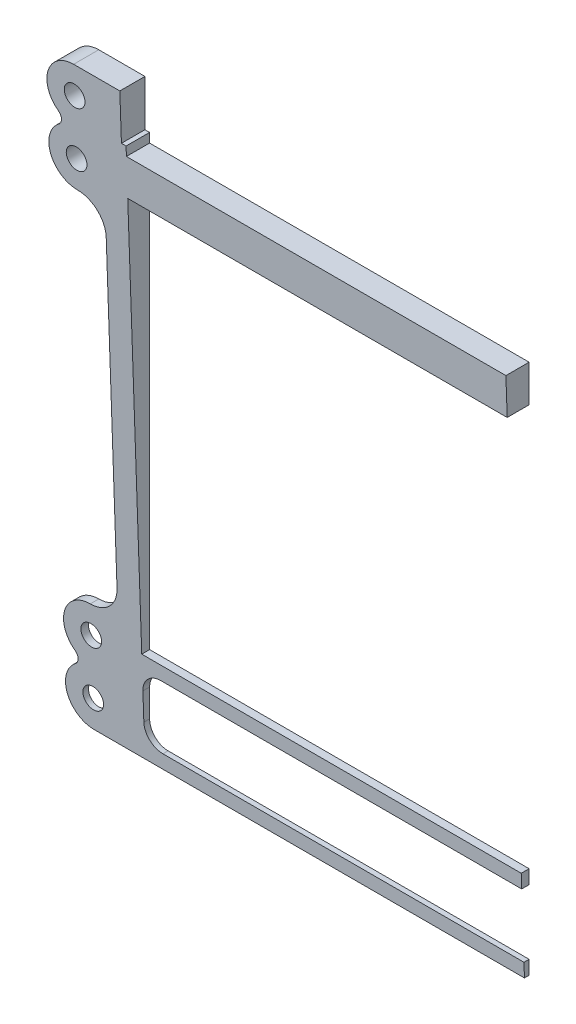
ISO-10303-21;
HEADER;
FILE_DESCRIPTION(('STEP AP214'),'2;1');
FILE_NAME('part.step','',(''),(''),'','','');
FILE_SCHEMA(('AUTOMOTIVE_DESIGN { 1 0 10303 214 1 1 1 1 }'));
ENDSEC;
DATA;
#1=APPLICATION_CONTEXT('core data for automotive mechanical design processes');
#2=APPLICATION_PROTOCOL_DEFINITION('international standard','automotive_design',2000,#1);
#3=PRODUCT_CONTEXT('',#1,'mechanical');
#4=PRODUCT('Part','Part','',(#3));
#5=PRODUCT_RELATED_PRODUCT_CATEGORY('part','',(#4));
#6=PRODUCT_DEFINITION_FORMATION('','',#4);
#7=PRODUCT_DEFINITION_CONTEXT('part definition',#1,'design');
#8=PRODUCT_DEFINITION('design','',#6,#7);
#9=PRODUCT_DEFINITION_SHAPE('','',#8);
#10=(LENGTH_UNIT() NAMED_UNIT(*) SI_UNIT(.MILLI.,.METRE.));
#11=(NAMED_UNIT(*) PLANE_ANGLE_UNIT() SI_UNIT($,.RADIAN.));
#12=(NAMED_UNIT(*) SI_UNIT($,.STERADIAN.) SOLID_ANGLE_UNIT());
#13=UNCERTAINTY_MEASURE_WITH_UNIT(LENGTH_MEASURE(1.E-05),#10,'distance_accuracy_value','');
#14=(GEOMETRIC_REPRESENTATION_CONTEXT(3) GLOBAL_UNCERTAINTY_ASSIGNED_CONTEXT((#13)) GLOBAL_UNIT_ASSIGNED_CONTEXT((#10,
#11,#12)) REPRESENTATION_CONTEXT('',''));
#15=CARTESIAN_POINT('',(0.,0.,0.));
#16=DIRECTION('',(0.,0.,1.));
#17=DIRECTION('',(1.,0.,0.));
#18=AXIS2_PLACEMENT_3D('',#15,#16,#17);
#19=CARTESIAN_POINT('',(0.,9.52500000000004,76.2));
#20=DIRECTION('',(0.,-1.,0.));
#21=DIRECTION('',(1.,0.,0.));
#22=AXIS2_PLACEMENT_3D('',#19,#20,#21);
#23=PLANE('',#22);
#24=DIRECTION('',(1.,0.,0.));
#25=VECTOR('',#24,1.);
#26=CARTESIAN_POINT('',(0.,9.52500000000004,2.70893443136311));
#27=LINE('',#26,#25);
#28=CARTESIAN_POINT('',(-268.897099999997,9.52500000000005,2.7089344313631));
#29=VERTEX_POINT('',#28);
#30=CARTESIAN_POINT('',(-138.423649999999,9.52500000000006,2.7089344313631));
#31=VERTEX_POINT('',#30);
#32=EDGE_CURVE('E233',#29,#31,#27,.T.);
#33=ORIENTED_EDGE('',*,*,#32,.T.);
#34=DIRECTION('',(0.,0.,-1.));
#35=VECTOR('',#34,1.);
#36=CARTESIAN_POINT('',(-138.423649999999,9.52500000000004,76.2));
#37=LINE('',#36,#35);
#38=CARTESIAN_POINT('',(-138.423649999999,9.52500000000005,0.));
#39=VERTEX_POINT('',#38);
#40=EDGE_CURVE('E803',#31,#39,#37,.T.);
#41=ORIENTED_EDGE('',*,*,#40,.T.);
#42=DIRECTION('',(-1.,0.,0.));
#43=VECTOR('',#42,1.);
#44=CARTESIAN_POINT('',(0.,9.52500000000004,0.));
#45=LINE('',#44,#43);
#46=CARTESIAN_POINT('',(-268.897099999997,9.52500000000005,0.));
#47=VERTEX_POINT('',#46);
#48=EDGE_CURVE('E300',#39,#47,#45,.T.);
#49=ORIENTED_EDGE('',*,*,#48,.T.);
#50=DIRECTION('',(0.,0.,-1.));
#51=VECTOR('',#50,1.);
#52=CARTESIAN_POINT('',(-268.897099999997,9.52500000000005,76.2));
#53=LINE('',#52,#51);
#54=EDGE_CURVE('E321',#29,#47,#53,.T.);
#55=ORIENTED_EDGE('',*,*,#54,.F.);
#56=EDGE_LOOP('',(#33,#41,#49,#55));
#57=FACE_BOUND('',#56,.T.);
#58=ADVANCED_FACE('F34',(#57),#23,.F.);
#59=CARTESIAN_POINT('',(-268.897099999997,0.,76.2));
#60=DIRECTION('',(-1.,0.,0.));
#61=DIRECTION('',(0.,0.,1.));
#62=AXIS2_PLACEMENT_3D('',#59,#60,#61);
#63=PLANE('',#62);
#64=DIRECTION('',(0.,0.,-1.));
#65=VECTOR('',#64,1.);
#66=CARTESIAN_POINT('',(-268.897099999997,147.6502,76.2));
#67=LINE('',#66,#65);
#68=CARTESIAN_POINT('',(-268.897099999997,147.6502,7.53237270156516));
#69=VERTEX_POINT('',#68);
#70=CARTESIAN_POINT('',(-268.897099999997,147.6502,0.));
#71=VERTEX_POINT('',#70);
#72=EDGE_CURVE('E319',#69,#71,#67,.T.);
#73=ORIENTED_EDGE('',*,*,#72,.F.);
#74=DIRECTION('',(0.,-0.999390827019096,-0.0348994967025044));
#75=VECTOR('',#74,1.);
#76=CARTESIAN_POINT('',(-268.897099999997,2.57484000352105,2.46622949619527));
#77=LINE('',#76,#75);
#78=EDGE_CURVE('E229',#69,#29,#77,.T.);
#79=ORIENTED_EDGE('',*,*,#78,.T.);
#80=ORIENTED_EDGE('',*,*,#54,.T.);
#81=DIRECTION('',(0.,1.,0.));
#82=VECTOR('',#81,1.);
#83=CARTESIAN_POINT('',(-268.897099999997,0.,0.));
#84=LINE('',#83,#82);
#85=EDGE_CURVE('E302',#47,#71,#84,.T.);
#86=ORIENTED_EDGE('',*,*,#85,.T.);
#87=EDGE_LOOP('',(#73,#79,#80,#86));
#88=FACE_BOUND('',#87,.T.);
#89=ADVANCED_FACE('F477',(#88),#63,.F.);
#90=CARTESIAN_POINT('',(0.,-22.225,76.2));
#91=DIRECTION('',(0.,1.,0.));
#92=DIRECTION('',(0.,0.,1.));
#93=AXIS2_PLACEMENT_3D('',#90,#91,#92);
#94=PLANE('',#93);
#95=DIRECTION('',(1.,0.,0.));
#96=VECTOR('',#95,1.);
#97=CARTESIAN_POINT('',(0.,-22.225,0.));
#98=LINE('',#97,#96);
#99=CARTESIAN_POINT('',(-286.359599999998,-22.225,0.));
#100=VERTEX_POINT('',#99);
#101=CARTESIAN_POINT('',(-138.423649999999,-22.225,0.));
#102=VERTEX_POINT('',#101);
#103=EDGE_CURVE('E264',#100,#102,#98,.T.);
#104=ORIENTED_EDGE('',*,*,#103,.T.);
#105=DIRECTION('',(0.,0.,1.));
#106=VECTOR('',#105,1.);
#107=CARTESIAN_POINT('',(-138.423649999999,-22.225,76.2));
#108=LINE('',#107,#106);
#109=CARTESIAN_POINT('',(-138.423649999999,-22.225,1.6002));
#110=VERTEX_POINT('',#109);
#111=EDGE_CURVE('E811',#102,#110,#108,.T.);
#112=ORIENTED_EDGE('',*,*,#111,.T.);
#113=DIRECTION('',(-1.,0.,0.));
#114=VECTOR('',#113,1.);
#115=CARTESIAN_POINT('',(19.0500000000025,-22.225,1.6002));
#116=LINE('',#115,#114);
#117=CARTESIAN_POINT('',(-286.359599999998,-22.225,1.6002));
#118=VERTEX_POINT('',#117);
#119=EDGE_CURVE('E418',#110,#118,#116,.T.);
#120=ORIENTED_EDGE('',*,*,#119,.T.);
#121=DIRECTION('',(0.,0.,-1.));
#122=VECTOR('',#121,1.);
#123=CARTESIAN_POINT('',(-286.359599999998,-22.225,76.2));
#124=LINE('',#123,#122);
#125=EDGE_CURVE('E318',#118,#100,#124,.T.);
#126=ORIENTED_EDGE('',*,*,#125,.T.);
#127=EDGE_LOOP('',(#104,#112,#120,#126));
#128=FACE_BOUND('',#127,.T.);
#129=ADVANCED_FACE('F470',(#128),#94,.F.);
#130=CARTESIAN_POINT('',(0.,160.3502,76.2));
#131=DIRECTION('',(0.,-1.,0.));
#132=DIRECTION('',(0.,0.,-1.));
#133=AXIS2_PLACEMENT_3D('',#130,#131,#132);
#134=PLANE('',#133);
#135=DIRECTION('',(1.,0.,0.));
#136=VECTOR('',#135,1.);
#137=CARTESIAN_POINT('',(0.,160.3502,7.97586647411037));
#138=LINE('',#137,#136);
#139=CARTESIAN_POINT('',(-268.909799999999,160.3502,7.97586647411037));
#140=VERTEX_POINT('',#139);
#141=CARTESIAN_POINT('',(-138.423649999999,160.3502,7.97586647411037));
#142=VERTEX_POINT('',#141);
#143=EDGE_CURVE('E262',#140,#142,#138,.T.);
#144=ORIENTED_EDGE('',*,*,#143,.T.);
#145=DIRECTION('',(0.,0.,-1.));
#146=VECTOR('',#145,1.);
#147=CARTESIAN_POINT('',(-138.423649999999,160.3502,76.2));
#148=LINE('',#147,#146);
#149=CARTESIAN_POINT('',(-138.423649999999,160.3502,0.));
#150=VERTEX_POINT('',#149);
#151=EDGE_CURVE('E49',#142,#150,#148,.T.);
#152=ORIENTED_EDGE('',*,*,#151,.T.);
#153=DIRECTION('',(-1.,0.,0.));
#154=VECTOR('',#153,1.);
#155=CARTESIAN_POINT('',(0.,160.3502,0.));
#156=LINE('',#155,#154);
#157=CARTESIAN_POINT('',(-268.909799999999,160.3502,0.));
#158=VERTEX_POINT('',#157);
#159=EDGE_CURVE('E267',#150,#158,#156,.T.);
#160=ORIENTED_EDGE('',*,*,#159,.T.);
#161=DIRECTION('',(0.,0.,-1.));
#162=VECTOR('',#161,1.);
#163=CARTESIAN_POINT('',(-268.909799999999,160.3502,76.2));
#164=LINE('',#163,#162);
#165=EDGE_CURVE('E322',#140,#158,#164,.T.);
#166=ORIENTED_EDGE('',*,*,#165,.F.);
#167=EDGE_LOOP('',(#144,#152,#160,#166));
#168=FACE_BOUND('',#167,.T.);
#169=ADVANCED_FACE('F468',(#168),#134,.F.);
#170=CARTESIAN_POINT('',(-268.909799999999,0.,76.2));
#171=DIRECTION('',(-1.,0.,0.));
#172=DIRECTION('',(0.,0.,1.));
#173=AXIS2_PLACEMENT_3D('',#170,#171,#172);
#174=PLANE('',#173);
#175=DIRECTION('',(0.,0.,-1.));
#176=VECTOR('',#175,1.);
#177=CARTESIAN_POINT('',(-268.909799999999,163.5252,76.2));
#178=LINE('',#177,#176);
#179=CARTESIAN_POINT('',(-268.909799999999,163.5252,8.08673991724669));
#180=VERTEX_POINT('',#179);
#181=CARTESIAN_POINT('',(-268.909799999999,163.5252,0.));
#182=VERTEX_POINT('',#181);
#183=EDGE_CURVE('E343',#180,#182,#178,.T.);
#184=ORIENTED_EDGE('',*,*,#183,.F.);
#185=DIRECTION('',(0.,-0.999390827019096,-0.0348994967025044));
#186=VECTOR('',#185,1.);
#187=CARTESIAN_POINT('',(-268.909799999999,2.57484000352105,2.46622949619527));
#188=LINE('',#187,#186);
#189=EDGE_CURVE('E259',#180,#140,#188,.T.);
#190=ORIENTED_EDGE('',*,*,#189,.T.);
#191=ORIENTED_EDGE('',*,*,#165,.T.);
#192=DIRECTION('',(0.,1.,0.));
#193=VECTOR('',#192,1.);
#194=CARTESIAN_POINT('',(-268.909799999999,0.,0.));
#195=LINE('',#194,#193);
#196=EDGE_CURVE('E269',#158,#182,#195,.T.);
#197=ORIENTED_EDGE('',*,*,#196,.T.);
#198=EDGE_LOOP('',(#184,#190,#191,#197));
#199=FACE_BOUND('',#198,.T.);
#200=ADVANCED_FACE('F465',(#199),#174,.F.);
#201=CARTESIAN_POINT('',(0.,163.5252,76.2));
#202=DIRECTION('',(0.,-1.,0.));
#203=DIRECTION('',(0.,0.,-1.));
#204=AXIS2_PLACEMENT_3D('',#201,#202,#203);
#205=PLANE('',#204);
#206=DIRECTION('',(0.,0.,-1.));
#207=VECTOR('',#206,1.);
#208=CARTESIAN_POINT('',(-270.509999999999,163.5252,76.2));
#209=LINE('',#208,#207);
#210=CARTESIAN_POINT('',(-270.509999999999,163.5252,8.08673991724668));
#211=VERTEX_POINT('',#210);
#212=CARTESIAN_POINT('',(-270.509999999999,163.5252,0.));
#213=VERTEX_POINT('',#212);
#214=EDGE_CURVE('E341',#211,#213,#209,.T.);
#215=ORIENTED_EDGE('',*,*,#214,.F.);
#216=DIRECTION('',(1.,0.,0.));
#217=VECTOR('',#216,1.);
#218=CARTESIAN_POINT('',(0.,163.5252,8.08673991724669));
#219=LINE('',#218,#217);
#220=EDGE_CURVE('E256',#211,#180,#219,.T.);
#221=ORIENTED_EDGE('',*,*,#220,.T.);
#222=ORIENTED_EDGE('',*,*,#183,.T.);
#223=DIRECTION('',(-1.,0.,0.));
#224=VECTOR('',#223,1.);
#225=CARTESIAN_POINT('',(0.,163.5252,0.));
#226=LINE('',#225,#224);
#227=EDGE_CURVE('E272',#182,#213,#226,.T.);
#228=ORIENTED_EDGE('',*,*,#227,.T.);
#229=EDGE_LOOP('',(#215,#221,#222,#228));
#230=FACE_BOUND('',#229,.T.);
#231=ADVANCED_FACE('F462',(#230),#205,.F.);
#232=CARTESIAN_POINT('',(-270.509999999999,0.,76.2));
#233=DIRECTION('',(-1.,0.,0.));
#234=DIRECTION('',(0.,0.,1.));
#235=AXIS2_PLACEMENT_3D('',#232,#233,#234);
#236=PLANE('',#235);
#237=DIRECTION('',(0.,0.,-1.));
#238=VECTOR('',#237,1.);
#239=CARTESIAN_POINT('',(-270.509999999999,179.4002,76.2));
#240=LINE('',#239,#238);
#241=CARTESIAN_POINT('',(-270.509999999999,179.4002,8.64110713292823));
#242=VERTEX_POINT('',#241);
#243=CARTESIAN_POINT('',(-270.509999999999,179.4002,0.));
#244=VERTEX_POINT('',#243);
#245=EDGE_CURVE('E339',#242,#244,#240,.T.);
#246=ORIENTED_EDGE('',*,*,#245,.F.);
#247=DIRECTION('',(0.,-0.999390827019096,-0.0348994967025044));
#248=VECTOR('',#247,1.);
#249=CARTESIAN_POINT('',(-270.509999999999,2.57484000352105,2.46622949619527));
#250=LINE('',#249,#248);
#251=EDGE_CURVE('E253',#242,#211,#250,.T.);
#252=ORIENTED_EDGE('',*,*,#251,.T.);
#253=ORIENTED_EDGE('',*,*,#214,.T.);
#254=DIRECTION('',(0.,1.,0.));
#255=VECTOR('',#254,1.);
#256=CARTESIAN_POINT('',(-270.509999999999,0.,0.));
#257=LINE('',#256,#255);
#258=EDGE_CURVE('E275',#213,#244,#257,.T.);
#259=ORIENTED_EDGE('',*,*,#258,.T.);
#260=EDGE_LOOP('',(#246,#252,#253,#259));
#261=FACE_BOUND('',#260,.T.);
#262=ADVANCED_FACE('F459',(#261),#236,.F.);
#263=CARTESIAN_POINT('',(0.,179.4002,76.2));
#264=DIRECTION('',(0.,-1.,0.));
#265=DIRECTION('',(0.,0.,-1.));
#266=AXIS2_PLACEMENT_3D('',#263,#264,#265);
#267=PLANE('',#266);
#268=DIRECTION('',(0.,0.,-1.));
#269=VECTOR('',#268,1.);
#270=CARTESIAN_POINT('',(-286.384999999999,179.4002,76.2));
#271=LINE('',#270,#269);
#272=CARTESIAN_POINT('',(-286.384999999999,179.4002,8.64110713292823));
#273=VERTEX_POINT('',#272);
#274=CARTESIAN_POINT('',(-286.384999999999,179.4002,0.));
#275=VERTEX_POINT('',#274);
#276=EDGE_CURVE('E337',#273,#275,#271,.T.);
#277=ORIENTED_EDGE('',*,*,#276,.F.);
#278=DIRECTION('',(-1.,0.,0.));
#279=VECTOR('',#278,1.);
#280=CARTESIAN_POINT('',(19.0500000000025,179.4002,8.64110713292823));
#281=LINE('',#280,#279);
#282=EDGE_CURVE('E417',#242,#273,#281,.T.);
#283=ORIENTED_EDGE('',*,*,#282,.F.);
#284=ORIENTED_EDGE('',*,*,#245,.T.);
#285=DIRECTION('',(-1.,0.,0.));
#286=VECTOR('',#285,1.);
#287=CARTESIAN_POINT('',(0.,179.4002,0.));
#288=LINE('',#287,#286);
#289=EDGE_CURVE('E278',#244,#275,#288,.T.);
#290=ORIENTED_EDGE('',*,*,#289,.T.);
#291=EDGE_LOOP('',(#277,#283,#284,#290));
#292=FACE_BOUND('',#291,.T.);
#293=ADVANCED_FACE('F453',(#292),#267,.F.);
#294=CARTESIAN_POINT('',(-286.384999999999,169.8752,76.2));
#295=DIRECTION('',(0.,0.,-1.));
#296=DIRECTION('',(-1.,0.,0.));
#297=AXIS2_PLACEMENT_3D('',#294,#295,#296);
#298=CYLINDRICAL_SURFACE('',#297,9.52500000000001);
#299=CARTESIAN_POINT('',(-286.384999999999,169.8752,0.));
#300=DIRECTION('',(0.,0.,1.));
#301=DIRECTION('',(1.,0.,0.));
#302=AXIS2_PLACEMENT_3D('',#299,#300,#301);
#303=CIRCLE('',#302,9.52500000000001);
#304=CARTESIAN_POINT('',(-292.226279898648,162.35156562919,0.));
#305=VERTEX_POINT('',#304);
#306=EDGE_CURVE('E281',#275,#305,#303,.T.);
#307=ORIENTED_EDGE('',*,*,#306,.T.);
#308=DIRECTION('',(0.,0.,-1.));
#309=VECTOR('',#308,1.);
#310=CARTESIAN_POINT('',(-292.226279898648,162.35156562919,76.2));
#311=LINE('',#310,#309);
#312=CARTESIAN_POINT('',(-292.226279898648,162.35156562919,8.04575570191603));
#313=VERTEX_POINT('',#312);
#314=EDGE_CURVE('E349',#305,#313,#311,.F.);
#315=ORIENTED_EDGE('',*,*,#314,.T.);
#316=CARTESIAN_POINT('',(-286.384999999999,169.8752,8.30848680351931));
#317=DIRECTION('',(0.,0.0348994967025044,-0.999390827019096));
#318=DIRECTION('',(0.,-0.999390827019096,-0.0348994967025044));
#319=AXIS2_PLACEMENT_3D('',#316,#317,#318);
#320=ELLIPSE('',#319,9.53080590944628,9.52500000000001);
#321=EDGE_CURVE('E231',#313,#273,#320,.T.);
#322=ORIENTED_EDGE('',*,*,#321,.T.);
#323=ORIENTED_EDGE('',*,*,#276,.T.);
#324=EDGE_LOOP('',(#307,#315,#322,#323));
#325=FACE_BOUND('',#324,.T.);
#326=ADVANCED_FACE('F448',(#325),#298,.T.);
#327=CARTESIAN_POINT('',(-286.372299999997,150.8252,76.2));
#328=DIRECTION('',(0.,0.,-1.));
#329=DIRECTION('',(-1.,0.,0.));
#330=AXIS2_PLACEMENT_3D('',#327,#328,#329);
#331=CYLINDRICAL_SURFACE('',#330,9.52500000000001);
#332=CARTESIAN_POINT('',(-286.372299999997,150.8252,7.64324614470145));
#333=DIRECTION('',(0.,0.0348994967025044,-0.999390827019096));
#334=DIRECTION('',(0.,-0.999390827019096,-0.0348994967025044));
#335=AXIS2_PLACEMENT_3D('',#332,#333,#334);
#336=ELLIPSE('',#335,9.53080590944628,9.52500000000001);
#337=CARTESIAN_POINT('',(-286.372299999997,141.3002,7.31062581529253));
#338=VERTEX_POINT('',#337);
#339=CARTESIAN_POINT('',(-292.223606214438,158.3410393134,7.90570503690175));
#340=VERTEX_POINT('',#339);
#341=EDGE_CURVE('E235',#338,#340,#336,.T.);
#342=ORIENTED_EDGE('',*,*,#341,.T.);
#343=DIRECTION('',(0.,0.,-1.));
#344=VECTOR('',#343,1.);
#345=CARTESIAN_POINT('',(-292.223606214438,158.3410393134,76.2));
#346=LINE('',#345,#344);
#347=CARTESIAN_POINT('',(-292.223606214438,158.3410393134,0.));
#348=VERTEX_POINT('',#347);
#349=EDGE_CURVE('E325',#340,#348,#346,.T.);
#350=ORIENTED_EDGE('',*,*,#349,.T.);
#351=CARTESIAN_POINT('',(-286.372299999997,150.8252,0.));
#352=DIRECTION('',(0.,0.,1.));
#353=DIRECTION('',(1.,0.,0.));
#354=AXIS2_PLACEMENT_3D('',#351,#352,#353);
#355=CIRCLE('',#354,9.52500000000001);
#356=CARTESIAN_POINT('',(-286.372299999997,141.3002,0.));
#357=VERTEX_POINT('',#356);
#358=EDGE_CURVE('E284',#348,#357,#355,.T.);
#359=ORIENTED_EDGE('',*,*,#358,.T.);
#360=DIRECTION('',(0.,0.,-1.));
#361=VECTOR('',#360,1.);
#362=CARTESIAN_POINT('',(-286.372299999997,141.3002,76.2));
#363=LINE('',#362,#361);
#364=EDGE_CURVE('E334',#338,#357,#363,.T.);
#365=ORIENTED_EDGE('',*,*,#364,.F.);
#366=EDGE_LOOP('',(#342,#350,#359,#365));
#367=FACE_BOUND('',#366,.T.);
#368=ADVANCED_FACE('F438',(#367),#331,.T.);
#369=CARTESIAN_POINT('',(-286.372299999997,131.7752,76.2));
#370=DIRECTION('',(0.,0.,-1.));
#371=DIRECTION('',(-1.,0.,0.));
#372=AXIS2_PLACEMENT_3D('',#369,#370,#371);
#373=CYLINDRICAL_SURFACE('',#372,9.52500000000001);
#374=CARTESIAN_POINT('',(-286.372299999997,131.7752,6.97800548588359));
#375=DIRECTION('',(0.,0.0348994967025044,-0.999390827019096));
#376=DIRECTION('',(0.,-0.999390827019096,-0.0348994967025044));
#377=AXIS2_PLACEMENT_3D('',#374,#375,#376);
#378=ELLIPSE('',#377,9.53080590944628,9.52500000000001);
#379=CARTESIAN_POINT('',(-276.847299999997,131.7752,6.97800548588358));
#380=VERTEX_POINT('',#379);
#381=EDGE_CURVE('E433',#338,#380,#378,.T.);
#382=ORIENTED_EDGE('',*,*,#381,.F.);
#383=ORIENTED_EDGE('',*,*,#364,.T.);
#384=CARTESIAN_POINT('',(-286.372299999997,131.7752,0.));
#385=DIRECTION('',(0.,0.,1.));
#386=DIRECTION('',(1.,0.,0.));
#387=AXIS2_PLACEMENT_3D('',#384,#385,#386);
#388=CIRCLE('',#387,9.52500000000001);
#389=CARTESIAN_POINT('',(-276.847299999997,131.7752,0.));
#390=VERTEX_POINT('',#389);
#391=EDGE_CURVE('E286',#390,#357,#388,.T.);
#392=ORIENTED_EDGE('',*,*,#391,.F.);
#393=DIRECTION('',(0.,0.,-1.));
#394=VECTOR('',#393,1.);
#395=CARTESIAN_POINT('',(-276.847299999997,131.7752,76.2));
#396=LINE('',#395,#394);
#397=EDGE_CURVE('E332',#380,#390,#396,.T.);
#398=ORIENTED_EDGE('',*,*,#397,.F.);
#399=EDGE_LOOP('',(#382,#383,#392,#398));
#400=FACE_BOUND('',#399,.T.);
#401=ADVANCED_FACE('F506',(#400),#373,.F.);
#402=CARTESIAN_POINT('',(-276.847299999997,0.,76.2));
#403=DIRECTION('',(1.,0.,0.));
#404=DIRECTION('',(0.,0.,-1.));
#405=AXIS2_PLACEMENT_3D('',#402,#403,#404);
#406=PLANE('',#405);
#407=DIRECTION('',(0.,0.,-1.));
#408=VECTOR('',#407,1.);
#409=CARTESIAN_POINT('',(-276.847299999997,25.4,76.2));
#410=LINE('',#409,#408);
#411=CARTESIAN_POINT('',(-276.847299999997,25.4,3.26330164704465));
#412=VERTEX_POINT('',#411);
#413=CARTESIAN_POINT('',(-276.847299999997,25.4,0.));
#414=VERTEX_POINT('',#413);
#415=EDGE_CURVE('E330',#412,#414,#410,.T.);
#416=ORIENTED_EDGE('',*,*,#415,.F.);
#417=DIRECTION('',(0.,0.999390827019096,0.0348994967025044));
#418=VECTOR('',#417,1.);
#419=CARTESIAN_POINT('',(-276.847299999997,2.57484000352105,2.46622949619527));
#420=LINE('',#419,#418);
#421=EDGE_CURVE('E430',#412,#380,#420,.T.);
#422=ORIENTED_EDGE('',*,*,#421,.T.);
#423=ORIENTED_EDGE('',*,*,#397,.T.);
#424=DIRECTION('',(0.,-1.,0.));
#425=VECTOR('',#424,1.);
#426=CARTESIAN_POINT('',(-276.847299999997,0.,0.));
#427=LINE('',#426,#425);
#428=EDGE_CURVE('E289',#390,#414,#427,.T.);
#429=ORIENTED_EDGE('',*,*,#428,.T.);
#430=EDGE_LOOP('',(#416,#422,#423,#429));
#431=FACE_BOUND('',#430,.T.);
#432=ADVANCED_FACE('F502',(#431),#406,.F.);
#433=CARTESIAN_POINT('',(-286.372299999997,25.4,76.2));
#434=DIRECTION('',(0.,0.,-1.));
#435=DIRECTION('',(-1.,0.,0.));
#436=AXIS2_PLACEMENT_3D('',#433,#434,#435);
#437=CYLINDRICAL_SURFACE('',#436,9.525);
#438=CARTESIAN_POINT('',(-286.372299999997,25.4,3.26330164704465));
#439=DIRECTION('',(0.,0.0348994967025044,-0.999390827019096));
#440=DIRECTION('',(0.,-0.999390827019096,-0.0348994967025044));
#441=AXIS2_PLACEMENT_3D('',#438,#439,#440);
#442=ELLIPSE('',#441,9.53080590944628,9.525);
#443=CARTESIAN_POINT('',(-286.372299999997,15.875,2.93068131763571));
#444=VERTEX_POINT('',#443);
#445=EDGE_CURVE('E427',#412,#444,#442,.T.);
#446=ORIENTED_EDGE('',*,*,#445,.F.);
#447=ORIENTED_EDGE('',*,*,#415,.T.);
#448=CARTESIAN_POINT('',(-286.372299999997,25.4,0.));
#449=DIRECTION('',(0.,0.,1.));
#450=DIRECTION('',(1.,0.,0.));
#451=AXIS2_PLACEMENT_3D('',#448,#449,#450);
#452=CIRCLE('',#451,9.525);
#453=CARTESIAN_POINT('',(-286.372299999997,15.875,0.));
#454=VERTEX_POINT('',#453);
#455=EDGE_CURVE('E292',#454,#414,#452,.T.);
#456=ORIENTED_EDGE('',*,*,#455,.F.);
#457=DIRECTION('',(0.,0.,-1.));
#458=VECTOR('',#457,1.);
#459=CARTESIAN_POINT('',(-286.372299999997,15.875,76.2));
#460=LINE('',#459,#458);
#461=EDGE_CURVE('E328',#444,#454,#460,.T.);
#462=ORIENTED_EDGE('',*,*,#461,.F.);
#463=EDGE_LOOP('',(#446,#447,#456,#462));
#464=FACE_BOUND('',#463,.T.);
#465=ADVANCED_FACE('F498',(#464),#437,.F.);
#466=CARTESIAN_POINT('',(-286.372299999997,6.35000000000004,76.2));
#467=DIRECTION('',(0.,0.,-1.));
#468=DIRECTION('',(-1.,0.,0.));
#469=AXIS2_PLACEMENT_3D('',#466,#467,#468);
#470=CYLINDRICAL_SURFACE('',#469,9.525);
#471=CARTESIAN_POINT('',(-286.372299999997,6.35000000000004,0.));
#472=DIRECTION('',(0.,0.,1.));
#473=DIRECTION('',(1.,0.,0.));
#474=AXIS2_PLACEMENT_3D('',#471,#472,#473);
#475=CIRCLE('',#474,9.525);
#476=CARTESIAN_POINT('',(-292.213579898648,-1.17363437080932,0.));
#477=VERTEX_POINT('',#476);
#478=EDGE_CURVE('E295',#454,#477,#475,.T.);
#479=ORIENTED_EDGE('',*,*,#478,.T.);
#480=DIRECTION('',(0.,0.,-1.));
#481=VECTOR('',#480,1.);
#482=CARTESIAN_POINT('',(-292.213579898648,-1.17363437080932,76.2));
#483=LINE('',#482,#481);
#484=CARTESIAN_POINT('',(-292.213579898648,-1.17363437080932,2.33532988662354));
#485=VERTEX_POINT('',#484);
#486=EDGE_CURVE('E354',#477,#485,#483,.F.);
#487=ORIENTED_EDGE('',*,*,#486,.T.);
#488=CARTESIAN_POINT('',(-286.372299999997,6.35000000000004,2.59806098822679));
#489=DIRECTION('',(0.,0.0348994967025044,-0.999390827019096));
#490=DIRECTION('',(0.,-0.999390827019096,-0.0348994967025044));
#491=AXIS2_PLACEMENT_3D('',#488,#489,#490);
#492=ELLIPSE('',#491,9.53080590944628,9.525);
#493=EDGE_CURVE('E425',#485,#444,#492,.T.);
#494=ORIENTED_EDGE('',*,*,#493,.T.);
#495=ORIENTED_EDGE('',*,*,#461,.T.);
#496=EDGE_LOOP('',(#479,#487,#494,#495));
#497=FACE_BOUND('',#496,.T.);
#498=ADVANCED_FACE('F494',(#497),#470,.T.);
#499=CARTESIAN_POINT('',(-286.359599999998,-12.7,76.2));
#500=DIRECTION('',(0.,0.,-1.));
#501=DIRECTION('',(-1.,0.,0.));
#502=AXIS2_PLACEMENT_3D('',#499,#500,#501);
#503=CYLINDRICAL_SURFACE('',#502,3.55600000000001);
#504=CARTESIAN_POINT('',(-286.359599999998,-12.7,1.93282032940893));
#505=DIRECTION('',(0.,0.0348994967025044,-0.999390827019096));
#506=DIRECTION('',(0.,-0.999390827019096,-0.0348994967025044));
#507=AXIS2_PLACEMENT_3D('',#504,#505,#506);
#508=ELLIPSE('',#507,3.55816753952662,3.55600000000001);
#509=CARTESIAN_POINT('',(-286.359599999998,-16.256,1.80864207309626));
#510=VERTEX_POINT('',#509);
#511=EDGE_CURVE('E250',#510,#510,#508,.T.);
#512=ORIENTED_EDGE('',*,*,#511,.F.);
#513=EDGE_LOOP('',(#512));
#514=FACE_BOUND('',#513,.T.);
#515=CARTESIAN_POINT('',(-286.359599999998,-12.7,0.));
#516=DIRECTION('',(0.,0.,1.));
#517=DIRECTION('',(1.,0.,0.));
#518=AXIS2_PLACEMENT_3D('',#515,#516,#517);
#519=CIRCLE('',#518,3.55600000000001);
#520=CARTESIAN_POINT('',(-282.803599999998,-12.7,0.));
#521=VERTEX_POINT('',#520);
#522=EDGE_CURVE('E315',#521,#521,#519,.T.);
#523=ORIENTED_EDGE('',*,*,#522,.F.);
#524=EDGE_LOOP('',(#523));
#525=FACE_BOUND('',#524,.T.);
#526=ADVANCED_FACE('F497',(#514,#525),#503,.F.);
#527=CARTESIAN_POINT('',(-286.384999999999,169.8752,76.2));
#528=DIRECTION('',(0.,0.,-1.));
#529=DIRECTION('',(-1.,0.,0.));
#530=AXIS2_PLACEMENT_3D('',#527,#528,#529);
#531=CYLINDRICAL_SURFACE('',#530,3.55600000000001);
#532=CARTESIAN_POINT('',(-286.384999999999,169.8752,8.30848680351931));
#533=DIRECTION('',(0.,0.0348994967025044,-0.999390827019096));
#534=DIRECTION('',(0.,-0.999390827019096,-0.0348994967025044));
#535=AXIS2_PLACEMENT_3D('',#532,#533,#534);
#536=ELLIPSE('',#535,3.55816753952662,3.55600000000001);
#537=CARTESIAN_POINT('',(-286.384999999999,166.3192,8.18430854720664));
#538=VERTEX_POINT('',#537);
#539=EDGE_CURVE('E247',#538,#538,#536,.T.);
#540=ORIENTED_EDGE('',*,*,#539,.F.);
#541=EDGE_LOOP('',(#540));
#542=FACE_BOUND('',#541,.T.);
#543=CARTESIAN_POINT('',(-286.384999999999,169.8752,0.));
#544=DIRECTION('',(0.,0.,1.));
#545=DIRECTION('',(1.,0.,0.));
#546=AXIS2_PLACEMENT_3D('',#543,#544,#545);
#547=CIRCLE('',#546,3.55600000000001);
#548=CARTESIAN_POINT('',(-282.828999999999,169.8752,0.));
#549=VERTEX_POINT('',#548);
#550=EDGE_CURVE('E312',#549,#549,#547,.T.);
#551=ORIENTED_EDGE('',*,*,#550,.F.);
#552=EDGE_LOOP('',(#551));
#553=FACE_BOUND('',#552,.T.);
#554=ADVANCED_FACE('F564',(#542,#553),#531,.F.);
#555=CARTESIAN_POINT('',(-286.372299999997,6.35000000000004,76.2));
#556=DIRECTION('',(0.,0.,-1.));
#557=DIRECTION('',(-1.,0.,0.));
#558=AXIS2_PLACEMENT_3D('',#555,#556,#557);
#559=CYLINDRICAL_SURFACE('',#558,3.55600000000001);
#560=CARTESIAN_POINT('',(-286.372299999997,6.35000000000004,2.59806098822679));
#561=DIRECTION('',(0.,0.0348994967025044,-0.999390827019096));
#562=DIRECTION('',(0.,-0.999390827019096,-0.0348994967025044));
#563=AXIS2_PLACEMENT_3D('',#560,#561,#562);
#564=ELLIPSE('',#563,3.55816753952662,3.55600000000001);
#565=CARTESIAN_POINT('',(-286.372299999997,2.79400000000003,2.47388273191412));
#566=VERTEX_POINT('',#565);
#567=EDGE_CURVE('E244',#566,#566,#564,.T.);
#568=ORIENTED_EDGE('',*,*,#567,.F.);
#569=EDGE_LOOP('',(#568));
#570=FACE_BOUND('',#569,.T.);
#571=CARTESIAN_POINT('',(-286.372299999997,6.35000000000004,0.));
#572=DIRECTION('',(0.,0.,1.));
#573=DIRECTION('',(1.,0.,0.));
#574=AXIS2_PLACEMENT_3D('',#571,#572,#573);
#575=CIRCLE('',#574,3.55600000000001);
#576=CARTESIAN_POINT('',(-282.816299999997,6.35000000000004,0.));
#577=VERTEX_POINT('',#576);
#578=EDGE_CURVE('E309',#577,#577,#575,.T.);
#579=ORIENTED_EDGE('',*,*,#578,.F.);
#580=EDGE_LOOP('',(#579));
#581=FACE_BOUND('',#580,.T.);
#582=ADVANCED_FACE('F572',(#570,#581),#559,.F.);
#583=CARTESIAN_POINT('',(-286.372299999997,150.8252,76.2));
#584=DIRECTION('',(0.,0.,-1.));
#585=DIRECTION('',(-1.,0.,0.));
#586=AXIS2_PLACEMENT_3D('',#583,#584,#585);
#587=CYLINDRICAL_SURFACE('',#586,3.55600000000001);
#588=CARTESIAN_POINT('',(-286.372299999997,150.8252,7.64324614470145));
#589=DIRECTION('',(0.,0.0348994967025044,-0.999390827019096));
#590=DIRECTION('',(0.,-0.999390827019096,-0.0348994967025044));
#591=AXIS2_PLACEMENT_3D('',#588,#589,#590);
#592=ELLIPSE('',#591,3.55816753952662,3.55600000000001);
#593=CARTESIAN_POINT('',(-286.372299999997,147.2692,7.51906788838878));
#594=VERTEX_POINT('',#593);
#595=EDGE_CURVE('E241',#594,#594,#592,.T.);
#596=ORIENTED_EDGE('',*,*,#595,.F.);
#597=EDGE_LOOP('',(#596));
#598=FACE_BOUND('',#597,.T.);
#599=CARTESIAN_POINT('',(-286.372299999997,150.8252,0.));
#600=DIRECTION('',(0.,0.,1.));
#601=DIRECTION('',(1.,0.,0.));
#602=AXIS2_PLACEMENT_3D('',#599,#600,#601);
#603=CIRCLE('',#602,3.55600000000001);
#604=CARTESIAN_POINT('',(-282.816299999997,150.8252,0.));
#605=VERTEX_POINT('',#604);
#606=EDGE_CURVE('E306',#605,#605,#603,.T.);
#607=ORIENTED_EDGE('',*,*,#606,.F.);
#608=EDGE_LOOP('',(#607));
#609=FACE_BOUND('',#608,.T.);
#610=ADVANCED_FACE('F580',(#598,#609),#587,.F.);
#611=CARTESIAN_POINT('',(0.,147.6502,76.2));
#612=DIRECTION('',(0.,1.,0.));
#613=DIRECTION('',(0.,0.,1.));
#614=AXIS2_PLACEMENT_3D('',#611,#612,#613);
#615=PLANE('',#614);
#616=DIRECTION('',(1.,0.,0.));
#617=VECTOR('',#616,1.);
#618=CARTESIAN_POINT('',(0.,147.6502,0.));
#619=LINE('',#618,#617);
#620=CARTESIAN_POINT('',(-138.423649999999,147.6502,0.));
#621=VERTEX_POINT('',#620);
#622=EDGE_CURVE('E222',#71,#621,#619,.T.);
#623=ORIENTED_EDGE('',*,*,#622,.T.);
#624=DIRECTION('',(0.,0.,1.));
#625=VECTOR('',#624,1.);
#626=CARTESIAN_POINT('',(-138.423649999999,147.6502,76.2));
#627=LINE('',#626,#625);
#628=CARTESIAN_POINT('',(-138.423649999999,147.6502,7.53237270156514));
#629=VERTEX_POINT('',#628);
#630=EDGE_CURVE('E207',#621,#629,#627,.T.);
#631=ORIENTED_EDGE('',*,*,#630,.T.);
#632=DIRECTION('',(-1.,0.,0.));
#633=VECTOR('',#632,1.);
#634=CARTESIAN_POINT('',(0.,147.6502,7.53237270156513));
#635=LINE('',#634,#633);
#636=EDGE_CURVE('E219',#629,#69,#635,.T.);
#637=ORIENTED_EDGE('',*,*,#636,.T.);
#638=ORIENTED_EDGE('',*,*,#72,.T.);
#639=EDGE_LOOP('',(#623,#631,#637,#638));
#640=FACE_BOUND('',#639,.T.);
#641=ADVANCED_FACE('F218',(#640),#615,.F.);
#642=CARTESIAN_POINT('',(-286.359599999998,-12.7,76.2));
#643=DIRECTION('',(0.,0.,-1.));
#644=DIRECTION('',(-1.,0.,0.));
#645=AXIS2_PLACEMENT_3D('',#642,#643,#644);
#646=CYLINDRICAL_SURFACE('',#645,9.525);
#647=CARTESIAN_POINT('',(-286.359599999998,-12.7,1.93282032940893));
#648=DIRECTION('',(0.,0.0348994967025044,-0.999390827019096));
#649=DIRECTION('',(0.,-0.999390827019096,-0.0348994967025044));
#650=AXIS2_PLACEMENT_3D('',#647,#648,#649);
#651=ELLIPSE('',#650,9.53080590944628,9.525);
#652=CARTESIAN_POINT('',(-292.210906214437,-5.18416068659879,2.19527922160926));
#653=VERTEX_POINT('',#652);
#654=EDGE_CURVE('E420',#118,#653,#651,.T.);
#655=ORIENTED_EDGE('',*,*,#654,.T.);
#656=DIRECTION('',(0.,0.,-1.));
#657=VECTOR('',#656,1.);
#658=CARTESIAN_POINT('',(-292.210906214437,-5.18416068659879,76.2));
#659=LINE('',#658,#657);
#660=CARTESIAN_POINT('',(-292.210906214437,-5.18416068659879,0.));
#661=VERTEX_POINT('',#660);
#662=EDGE_CURVE('E351',#653,#661,#659,.T.);
#663=ORIENTED_EDGE('',*,*,#662,.T.);
#664=CARTESIAN_POINT('',(-286.359599999998,-12.7,0.));
#665=DIRECTION('',(0.,0.,1.));
#666=DIRECTION('',(1.,0.,0.));
#667=AXIS2_PLACEMENT_3D('',#664,#665,#666);
#668=CIRCLE('',#667,9.525);
#669=EDGE_CURVE('E298',#661,#100,#668,.T.);
#670=ORIENTED_EDGE('',*,*,#669,.T.);
#671=ORIENTED_EDGE('',*,*,#125,.F.);
#672=EDGE_LOOP('',(#655,#663,#670,#671));
#673=FACE_BOUND('',#672,.T.);
#674=ADVANCED_FACE('F490',(#673),#646,.T.);
#675=CARTESIAN_POINT('',(0.,0.,0.));
#676=DIRECTION('',(0.,0.,1.));
#677=DIRECTION('',(1.,0.,0.));
#678=AXIS2_PLACEMENT_3D('',#675,#676,#677);
#679=PLANE('',#678);
#680=ORIENTED_EDGE('',*,*,#159,.F.);
#681=DIRECTION('',(0.,-1.,0.));
#682=VECTOR('',#681,1.);
#683=CARTESIAN_POINT('',(-138.423649999999,0.,0.));
#684=LINE('',#683,#682);
#685=EDGE_CURVE('E223',#150,#621,#684,.T.);
#686=ORIENTED_EDGE('',*,*,#685,.T.);
#687=ORIENTED_EDGE('',*,*,#622,.F.);
#688=ORIENTED_EDGE('',*,*,#85,.F.);
#689=ORIENTED_EDGE('',*,*,#48,.F.);
#690=CARTESIAN_POINT('',(-138.423649999999,4.74980000000005,0.));
#691=VERTEX_POINT('',#690);
#692=EDGE_CURVE('E212',#39,#691,#684,.T.);
#693=ORIENTED_EDGE('',*,*,#692,.T.);
#694=DIRECTION('',(1.,0.,0.));
#695=VECTOR('',#694,1.);
#696=CARTESIAN_POINT('',(-7.95019999999749,4.74980000000006,0.));
#697=LINE('',#696,#695);
#698=CARTESIAN_POINT('',(-262.547099999997,4.74980000000005,0.));
#699=VERTEX_POINT('',#698);
#700=EDGE_CURVE('E410',#699,#691,#697,.T.);
#701=ORIENTED_EDGE('',*,*,#700,.F.);
#702=CARTESIAN_POINT('',(-262.547099999997,-1.60019999999995,0.));
#703=DIRECTION('',(0.,0.,1.));
#704=DIRECTION('',(1.,0.,0.));
#705=AXIS2_PLACEMENT_3D('',#702,#703,#704);
#706=CIRCLE('',#705,6.35);
#707=CARTESIAN_POINT('',(-268.897099999997,-1.60019999999995,0.));
#708=VERTEX_POINT('',#707);
#709=EDGE_CURVE('E383',#699,#708,#706,.T.);
#710=ORIENTED_EDGE('',*,*,#709,.T.);
#711=DIRECTION('',(0.,1.,0.));
#712=VECTOR('',#711,1.);
#713=CARTESIAN_POINT('',(-268.897099999997,4.74980000000005,0.));
#714=LINE('',#713,#712);
#715=CARTESIAN_POINT('',(-268.897099999997,-11.0998,0.));
#716=VERTEX_POINT('',#715);
#717=EDGE_CURVE('E408',#716,#708,#714,.T.);
#718=ORIENTED_EDGE('',*,*,#717,.F.);
#719=CARTESIAN_POINT('',(-262.547099999997,-11.0998,0.));
#720=DIRECTION('',(0.,0.,1.));
#721=DIRECTION('',(1.,0.,0.));
#722=AXIS2_PLACEMENT_3D('',#719,#720,#721);
#723=CIRCLE('',#722,6.35);
#724=CARTESIAN_POINT('',(-262.547099999997,-17.4498,0.));
#725=VERTEX_POINT('',#724);
#726=EDGE_CURVE('E387',#716,#725,#723,.T.);
#727=ORIENTED_EDGE('',*,*,#726,.T.);
#728=DIRECTION('',(-1.,0.,0.));
#729=VECTOR('',#728,1.);
#730=CARTESIAN_POINT('',(-268.897099999997,-17.4498,0.));
#731=LINE('',#730,#729);
#732=CARTESIAN_POINT('',(-138.423649999999,-17.4498,0.));
#733=VERTEX_POINT('',#732);
#734=EDGE_CURVE('E407',#733,#725,#731,.T.);
#735=ORIENTED_EDGE('',*,*,#734,.F.);
#736=EDGE_CURVE('E57',#733,#102,#684,.T.);
#737=ORIENTED_EDGE('',*,*,#736,.T.);
#738=ORIENTED_EDGE('',*,*,#103,.F.);
#739=ORIENTED_EDGE('',*,*,#669,.F.);
#740=CARTESIAN_POINT('',(-293.771254538288,-3.17993686969182,0.));
#741=DIRECTION('',(0.,0.,1.));
#742=DIRECTION('',(1.,0.,0.));
#743=AXIS2_PLACEMENT_3D('',#740,#741,#742);
#744=CIRCLE('',#743,2.54);
#745=EDGE_CURVE('E360',#661,#477,#744,.T.);
#746=ORIENTED_EDGE('',*,*,#745,.T.);
#747=ORIENTED_EDGE('',*,*,#478,.F.);
#748=ORIENTED_EDGE('',*,*,#455,.T.);
#749=ORIENTED_EDGE('',*,*,#428,.F.);
#750=ORIENTED_EDGE('',*,*,#391,.T.);
#751=ORIENTED_EDGE('',*,*,#358,.F.);
#752=CARTESIAN_POINT('',(-293.783954538288,160.345263130307,0.));
#753=DIRECTION('',(0.,0.,1.));
#754=DIRECTION('',(1.,0.,0.));
#755=AXIS2_PLACEMENT_3D('',#752,#753,#754);
#756=CIRCLE('',#755,2.54);
#757=EDGE_CURVE('E356',#348,#305,#756,.T.);
#758=ORIENTED_EDGE('',*,*,#757,.T.);
#759=ORIENTED_EDGE('',*,*,#306,.F.);
#760=ORIENTED_EDGE('',*,*,#289,.F.);
#761=ORIENTED_EDGE('',*,*,#258,.F.);
#762=ORIENTED_EDGE('',*,*,#227,.F.);
#763=ORIENTED_EDGE('',*,*,#196,.F.);
#764=EDGE_LOOP('',(#680,#686,#687,#688,#689,#693,#701,#710,#718,#727,#735,#737,#738,#739,#746,
#747,#748,#749,#750,#751,#758,#759,#760,#761,#762,#763));
#765=FACE_BOUND('',#764,.T.);
#766=ORIENTED_EDGE('',*,*,#606,.T.);
#767=EDGE_LOOP('',(#766));
#768=FACE_BOUND('',#767,.T.);
#769=ORIENTED_EDGE('',*,*,#578,.T.);
#770=EDGE_LOOP('',(#769));
#771=FACE_BOUND('',#770,.T.);
#772=ORIENTED_EDGE('',*,*,#550,.T.);
#773=EDGE_LOOP('',(#772));
#774=FACE_BOUND('',#773,.T.);
#775=ORIENTED_EDGE('',*,*,#522,.T.);
#776=EDGE_LOOP('',(#775));
#777=FACE_BOUND('',#776,.T.);
#778=ADVANCED_FACE('F405',(#765,#768,#771,#774,#777),#679,.F.);
#779=CARTESIAN_POINT('',(19.0500000000025,-22.225,1.6002));
#780=DIRECTION('',(0.,0.0348994967025044,-0.999390827019096));
#781=DIRECTION('',(0.,0.999390827019096,0.0348994967025044));
#782=AXIS2_PLACEMENT_3D('',#779,#780,#781);
#783=PLANE('',#782);
#784=ORIENTED_EDGE('',*,*,#119,.F.);
#785=DIRECTION('',(0.,-0.999390827019096,-0.0348994967025044));
#786=VECTOR('',#785,1.);
#787=CARTESIAN_POINT('',(-138.423649999999,-42.9005162307363,0.878195063583495));
#788=LINE('',#787,#786);
#789=CARTESIAN_POINT('',(-138.423649999999,-17.4497999999999,1.76695365847701));
#790=VERTEX_POINT('',#789);
#791=EDGE_CURVE('E215',#790,#110,#788,.T.);
#792=ORIENTED_EDGE('',*,*,#791,.F.);
#793=DIRECTION('',(-1.,0.,0.));
#794=VECTOR('',#793,1.);
#795=CARTESIAN_POINT('',(19.0500000000025,-17.4497999999999,1.76695365847701));
#796=LINE('',#795,#794);
#797=CARTESIAN_POINT('',(-262.547099999997,-17.4498,1.76695365847701));
#798=VERTEX_POINT('',#797);
#799=EDGE_CURVE('E367',#790,#798,#796,.T.);
#800=ORIENTED_EDGE('',*,*,#799,.T.);
#801=CARTESIAN_POINT('',(-262.547099999997,-11.0998,1.98870054474963));
#802=DIRECTION('',(0.,0.0348994967025044,-0.999390827019096));
#803=DIRECTION('',(0.,0.999390827019096,0.0348994967025044));
#804=AXIS2_PLACEMENT_3D('',#801,#802,#803);
#805=ELLIPSE('',#804,6.35387060629752,6.35);
#806=CARTESIAN_POINT('',(-268.897099999997,-11.0998,1.98870054474963));
#807=VERTEX_POINT('',#806);
#808=EDGE_CURVE('E42',#798,#807,#805,.T.);
#809=ORIENTED_EDGE('',*,*,#808,.T.);
#810=DIRECTION('',(0.,0.999390827019096,0.0348994967025044));
#811=VECTOR('',#810,1.);
#812=CARTESIAN_POINT('',(-268.897099999997,-22.225,1.6002));
#813=LINE('',#812,#811);
#814=CARTESIAN_POINT('',(-268.897099999997,-1.60019999999995,2.32043388661347));
#815=VERTEX_POINT('',#814);
#816=EDGE_CURVE('E369',#807,#815,#813,.T.);
#817=ORIENTED_EDGE('',*,*,#816,.T.);
#818=CARTESIAN_POINT('',(-262.547099999997,-1.60019999999995,2.32043388661347));
#819=DIRECTION('',(0.,0.0348994967025044,-0.999390827019096));
#820=DIRECTION('',(0.,0.999390827019096,0.0348994967025044));
#821=AXIS2_PLACEMENT_3D('',#818,#819,#820);
#822=ELLIPSE('',#821,6.35387060629752,6.35);
#823=CARTESIAN_POINT('',(-262.547099999997,4.74980000000005,2.54218077288609));
#824=VERTEX_POINT('',#823);
#825=EDGE_CURVE('E385',#815,#824,#822,.T.);
#826=ORIENTED_EDGE('',*,*,#825,.T.);
#827=DIRECTION('',(1.,0.,0.));
#828=VECTOR('',#827,1.);
#829=CARTESIAN_POINT('',(19.0500000000025,4.74980000000006,2.54218077288609));
#830=LINE('',#829,#828);
#831=CARTESIAN_POINT('',(-138.423649999999,4.74980000000005,2.54218077288609));
#832=VERTEX_POINT('',#831);
#833=EDGE_CURVE('E364',#824,#832,#830,.T.);
#834=ORIENTED_EDGE('',*,*,#833,.T.);
#835=EDGE_CURVE('E213',#31,#832,#788,.T.);
#836=ORIENTED_EDGE('',*,*,#835,.F.);
#837=ORIENTED_EDGE('',*,*,#32,.F.);
#838=ORIENTED_EDGE('',*,*,#78,.F.);
#839=ORIENTED_EDGE('',*,*,#636,.F.);
#840=EDGE_CURVE('E204',#142,#629,#788,.T.);
#841=ORIENTED_EDGE('',*,*,#840,.F.);
#842=ORIENTED_EDGE('',*,*,#143,.F.);
#843=ORIENTED_EDGE('',*,*,#189,.F.);
#844=ORIENTED_EDGE('',*,*,#220,.F.);
#845=ORIENTED_EDGE('',*,*,#251,.F.);
#846=ORIENTED_EDGE('',*,*,#282,.T.);
#847=ORIENTED_EDGE('',*,*,#321,.F.);
#848=CARTESIAN_POINT('',(-293.783954538288,160.345263130307,7.97569407482183));
#849=DIRECTION('',(0.,0.0348994967025044,-0.999390827019096));
#850=DIRECTION('',(0.,0.999390827019096,0.0348994967025044));
#851=AXIS2_PLACEMENT_3D('',#848,#849,#850);
#852=ELLIPSE('',#851,2.54154824251901,2.54);
#853=EDGE_CURVE('E358',#313,#340,#852,.T.);
#854=ORIENTED_EDGE('',*,*,#853,.T.);
#855=ORIENTED_EDGE('',*,*,#341,.F.);
#856=ORIENTED_EDGE('',*,*,#381,.T.);
#857=ORIENTED_EDGE('',*,*,#421,.F.);
#858=ORIENTED_EDGE('',*,*,#445,.T.);
#859=ORIENTED_EDGE('',*,*,#493,.F.);
#860=CARTESIAN_POINT('',(-293.771254538288,-3.17993686969182,2.26526825952934));
#861=DIRECTION('',(0.,0.0348994967025044,-0.999390827019096));
#862=DIRECTION('',(0.,0.999390827019096,0.0348994967025044));
#863=AXIS2_PLACEMENT_3D('',#860,#861,#862);
#864=ELLIPSE('',#863,2.54154824251901,2.54);
#865=EDGE_CURVE('E362',#485,#653,#864,.T.);
#866=ORIENTED_EDGE('',*,*,#865,.T.);
#867=ORIENTED_EDGE('',*,*,#654,.F.);
#868=EDGE_LOOP('',(#784,#792,#800,#809,#817,#826,#834,#836,#837,#838,#839,#841,#842,#843,#844,
#845,#846,#847,#854,#855,#856,#857,#858,#859,#866,#867));
#869=FACE_BOUND('',#868,.T.);
#870=ORIENTED_EDGE('',*,*,#511,.T.);
#871=EDGE_LOOP('',(#870));
#872=FACE_BOUND('',#871,.T.);
#873=ORIENTED_EDGE('',*,*,#539,.T.);
#874=EDGE_LOOP('',(#873));
#875=FACE_BOUND('',#874,.T.);
#876=ORIENTED_EDGE('',*,*,#567,.T.);
#877=EDGE_LOOP('',(#876));
#878=FACE_BOUND('',#877,.T.);
#879=ORIENTED_EDGE('',*,*,#595,.T.);
#880=EDGE_LOOP('',(#879));
#881=FACE_BOUND('',#880,.T.);
#882=ADVANCED_FACE('F226',(#869,#872,#875,#878,#881),#783,.F.);
#883=CARTESIAN_POINT('',(-293.783954538288,160.345263130307,76.2));
#884=DIRECTION('',(0.,0.,1.));
#885=DIRECTION('',(1.,0.,0.));
#886=AXIS2_PLACEMENT_3D('',#883,#884,#885);
#887=CYLINDRICAL_SURFACE('',#886,2.54);
#888=ORIENTED_EDGE('',*,*,#853,.F.);
#889=ORIENTED_EDGE('',*,*,#314,.F.);
#890=ORIENTED_EDGE('',*,*,#757,.F.);
#891=ORIENTED_EDGE('',*,*,#349,.F.);
#892=EDGE_LOOP('',(#888,#889,#890,#891));
#893=FACE_BOUND('',#892,.T.);
#894=ADVANCED_FACE('F443',(#893),#887,.F.);
#895=CARTESIAN_POINT('',(-293.771254538288,-3.17993686969182,76.2));
#896=DIRECTION('',(0.,0.,1.));
#897=DIRECTION('',(1.,0.,0.));
#898=AXIS2_PLACEMENT_3D('',#895,#896,#897);
#899=CYLINDRICAL_SURFACE('',#898,2.54);
#900=ORIENTED_EDGE('',*,*,#865,.F.);
#901=ORIENTED_EDGE('',*,*,#486,.F.);
#902=ORIENTED_EDGE('',*,*,#745,.F.);
#903=ORIENTED_EDGE('',*,*,#662,.F.);
#904=EDGE_LOOP('',(#900,#901,#902,#903));
#905=FACE_BOUND('',#904,.T.);
#906=ADVANCED_FACE('F615',(#905),#899,.F.);
#907=CARTESIAN_POINT('',(-268.897099999997,4.74980000000005,8.64110713292829));
#908=DIRECTION('',(-1.,0.,0.));
#909=DIRECTION('',(0.,0.,1.));
#910=AXIS2_PLACEMENT_3D('',#907,#908,#909);
#911=PLANE('',#910);
#912=ORIENTED_EDGE('',*,*,#717,.T.);
#913=DIRECTION('',(0.,0.,-1.));
#914=VECTOR('',#913,1.);
#915=CARTESIAN_POINT('',(-268.897099999997,-1.60019999999995,2.54218077288609));
#916=LINE('',#915,#914);
#917=EDGE_CURVE('E378',#708,#815,#916,.F.);
#918=ORIENTED_EDGE('',*,*,#917,.T.);
#919=ORIENTED_EDGE('',*,*,#816,.F.);
#920=DIRECTION('',(0.,0.,-1.));
#921=VECTOR('',#920,1.);
#922=CARTESIAN_POINT('',(-268.897099999997,-11.0998,0.));
#923=LINE('',#922,#921);
#924=EDGE_CURVE('E375',#807,#716,#923,.T.);
#925=ORIENTED_EDGE('',*,*,#924,.T.);
#926=EDGE_LOOP('',(#912,#918,#919,#925));
#927=FACE_BOUND('',#926,.T.);
#928=ADVANCED_FACE('F399',(#927),#911,.F.);
#929=CARTESIAN_POINT('',(-268.897099999997,-17.4498,8.64110713292829));
#930=DIRECTION('',(0.,-1.,0.));
#931=DIRECTION('',(1.,0.,0.));
#932=AXIS2_PLACEMENT_3D('',#929,#930,#931);
#933=PLANE('',#932);
#934=ORIENTED_EDGE('',*,*,#799,.F.);
#935=DIRECTION('',(0.,0.,-1.));
#936=VECTOR('',#935,1.);
#937=CARTESIAN_POINT('',(-138.423649999999,-17.4498,8.64110713292829));
#938=LINE('',#937,#936);
#939=EDGE_CURVE('E809',#790,#733,#938,.T.);
#940=ORIENTED_EDGE('',*,*,#939,.T.);
#941=ORIENTED_EDGE('',*,*,#734,.T.);
#942=DIRECTION('',(0.,0.,-1.));
#943=VECTOR('',#942,1.);
#944=CARTESIAN_POINT('',(-262.547099999997,-17.4498,1.76695365847701));
#945=LINE('',#944,#943);
#946=EDGE_CURVE('E380',#725,#798,#945,.F.);
#947=ORIENTED_EDGE('',*,*,#946,.T.);
#948=EDGE_LOOP('',(#934,#940,#941,#947));
#949=FACE_BOUND('',#948,.T.);
#950=ADVANCED_FACE('F629',(#949),#933,.F.);
#951=CARTESIAN_POINT('',(-7.95019999999749,4.74980000000006,8.64110713292829));
#952=DIRECTION('',(0.,1.,0.));
#953=DIRECTION('',(-1.,0.,0.));
#954=AXIS2_PLACEMENT_3D('',#951,#952,#953);
#955=PLANE('',#954);
#956=ORIENTED_EDGE('',*,*,#700,.T.);
#957=DIRECTION('',(0.,0.,1.));
#958=VECTOR('',#957,1.);
#959=CARTESIAN_POINT('',(-138.423649999999,4.74980000000005,8.64110713292829));
#960=LINE('',#959,#958);
#961=EDGE_CURVE('E11',#691,#832,#960,.T.);
#962=ORIENTED_EDGE('',*,*,#961,.T.);
#963=ORIENTED_EDGE('',*,*,#833,.F.);
#964=DIRECTION('',(0.,0.,-1.));
#965=VECTOR('',#964,1.);
#966=CARTESIAN_POINT('',(-262.547099999997,4.74980000000005,0.));
#967=LINE('',#966,#965);
#968=EDGE_CURVE('E372',#824,#699,#967,.T.);
#969=ORIENTED_EDGE('',*,*,#968,.T.);
#970=EDGE_LOOP('',(#956,#962,#963,#969));
#971=FACE_BOUND('',#970,.T.);
#972=ADVANCED_FACE('F636',(#971),#955,.F.);
#973=CARTESIAN_POINT('',(-262.547099999997,-1.60019999999995,8.64110713292829));
#974=DIRECTION('',(0.,0.,1.));
#975=DIRECTION('',(1.,0.,0.));
#976=AXIS2_PLACEMENT_3D('',#973,#974,#975);
#977=CYLINDRICAL_SURFACE('',#976,6.35);
#978=ORIENTED_EDGE('',*,*,#825,.F.);
#979=ORIENTED_EDGE('',*,*,#917,.F.);
#980=ORIENTED_EDGE('',*,*,#709,.F.);
#981=ORIENTED_EDGE('',*,*,#968,.F.);
#982=EDGE_LOOP('',(#978,#979,#980,#981));
#983=FACE_BOUND('',#982,.T.);
#984=ADVANCED_FACE('F644',(#983),#977,.F.);
#985=CARTESIAN_POINT('',(-262.547099999997,-11.0998,8.64110713292829));
#986=DIRECTION('',(0.,0.,1.));
#987=DIRECTION('',(1.,0.,0.));
#988=AXIS2_PLACEMENT_3D('',#985,#986,#987);
#989=CYLINDRICAL_SURFACE('',#988,6.35);
#990=ORIENTED_EDGE('',*,*,#808,.F.);
#991=ORIENTED_EDGE('',*,*,#946,.F.);
#992=ORIENTED_EDGE('',*,*,#726,.F.);
#993=ORIENTED_EDGE('',*,*,#924,.F.);
#994=EDGE_LOOP('',(#990,#991,#992,#993));
#995=FACE_BOUND('',#994,.T.);
#996=ADVANCED_FACE('F36',(#995),#989,.F.);
#997=CARTESIAN_POINT('',(-138.423649999999,-42.5991296493172,-7.7523874180071));
#998=DIRECTION('',(-1.,0.,0.));
#999=DIRECTION('',(0.,0.,1.));
#1000=AXIS2_PLACEMENT_3D('',#997,#998,#999);
#1001=PLANE('',#1000);
#1002=ORIENTED_EDGE('',*,*,#835,.T.);
#1003=ORIENTED_EDGE('',*,*,#961,.F.);
#1004=ORIENTED_EDGE('',*,*,#692,.F.);
#1005=ORIENTED_EDGE('',*,*,#40,.F.);
#1006=EDGE_LOOP('',(#1002,#1003,#1004,#1005));
#1007=FACE_BOUND('',#1006,.T.);
#1008=ADVANCED_FACE('F658',(#1007),#1001,.F.);
#1009=ORIENTED_EDGE('',*,*,#736,.F.);
#1010=ORIENTED_EDGE('',*,*,#939,.F.);
#1011=ORIENTED_EDGE('',*,*,#791,.T.);
#1012=ORIENTED_EDGE('',*,*,#111,.F.);
#1013=EDGE_LOOP('',(#1009,#1010,#1011,#1012));
#1014=FACE_BOUND('',#1013,.T.);
#1015=ADVANCED_FACE('F663',(#1014),#1001,.F.);
#1016=ORIENTED_EDGE('',*,*,#840,.T.);
#1017=ORIENTED_EDGE('',*,*,#630,.F.);
#1018=ORIENTED_EDGE('',*,*,#685,.F.);
#1019=ORIENTED_EDGE('',*,*,#151,.F.);
#1020=EDGE_LOOP('',(#1016,#1017,#1018,#1019));
#1021=FACE_BOUND('',#1020,.T.);
#1022=ADVANCED_FACE('F206',(#1021),#1001,.F.);
#1023=CLOSED_SHELL('',(#58,#89,#129,#169,#200,#231,#262,#293,#326,#368,#401,#432,#465,#498,#526,
#554,#582,#610,#641,#674,#778,#882,#894,#906,#928,#950,#972,#984,#996,#1008,#1015,#1022));
#1024=MANIFOLD_SOLID_BREP('B2',#1023);
#1025=ADVANCED_BREP_SHAPE_REPRESENTATION('',(#18,#1024),#14);
#1026=SHAPE_DEFINITION_REPRESENTATION(#9,#1025);
ENDSEC;
END-ISO-10303-21;
